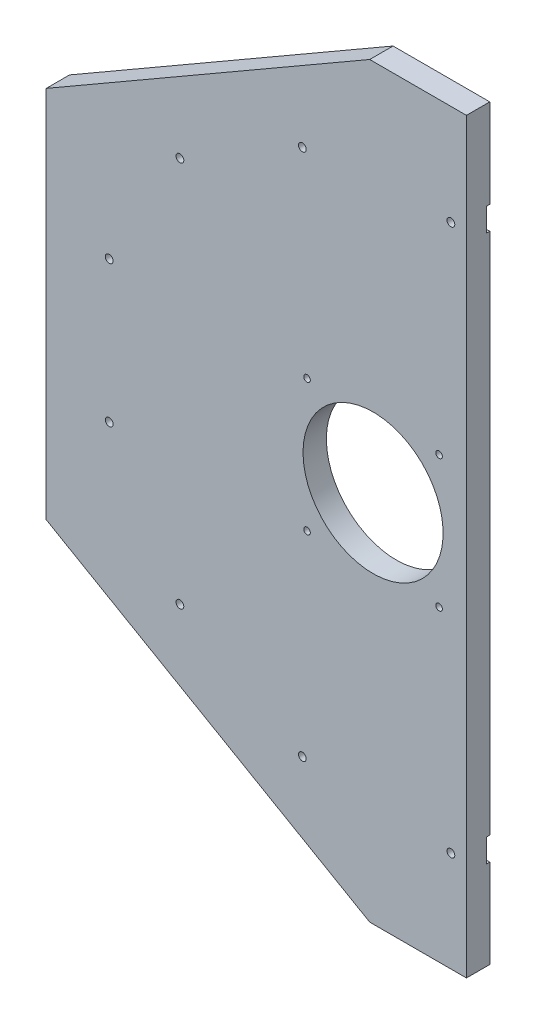
ISO-10303-21;
HEADER;
FILE_DESCRIPTION(('STEP AP214'),'2;1');
FILE_NAME('part.step','',(''),(''),'','','');
FILE_SCHEMA(('AUTOMOTIVE_DESIGN { 1 0 10303 214 1 1 1 1 }'));
ENDSEC;
DATA;
#1=APPLICATION_CONTEXT('core data for automotive mechanical design processes');
#2=APPLICATION_PROTOCOL_DEFINITION('international standard','automotive_design',2000,#1);
#3=PRODUCT_CONTEXT('',#1,'mechanical');
#4=PRODUCT('Part','Part','',(#3));
#5=PRODUCT_RELATED_PRODUCT_CATEGORY('part','',(#4));
#6=PRODUCT_DEFINITION_FORMATION('','',#4);
#7=PRODUCT_DEFINITION_CONTEXT('part definition',#1,'design');
#8=PRODUCT_DEFINITION('design','',#6,#7);
#9=PRODUCT_DEFINITION_SHAPE('','',#8);
#10=(LENGTH_UNIT() NAMED_UNIT(*) SI_UNIT(.MILLI.,.METRE.));
#11=(NAMED_UNIT(*) PLANE_ANGLE_UNIT() SI_UNIT($,.RADIAN.));
#12=(NAMED_UNIT(*) SI_UNIT($,.STERADIAN.) SOLID_ANGLE_UNIT());
#13=UNCERTAINTY_MEASURE_WITH_UNIT(LENGTH_MEASURE(1.E-05),#10,'distance_accuracy_value','');
#14=(GEOMETRIC_REPRESENTATION_CONTEXT(3) GLOBAL_UNCERTAINTY_ASSIGNED_CONTEXT((#13)) GLOBAL_UNIT_ASSIGNED_CONTEXT((#10,
#11,#12)) REPRESENTATION_CONTEXT('',''));
#15=CARTESIAN_POINT('',(0.,0.,0.));
#16=DIRECTION('',(0.,0.,1.));
#17=DIRECTION('',(1.,0.,0.));
#18=AXIS2_PLACEMENT_3D('',#15,#16,#17);
#19=CARTESIAN_POINT('',(0.,0.,0.));
#20=DIRECTION('',(0.,0.,1.));
#21=DIRECTION('',(1.,0.,0.));
#22=AXIS2_PLACEMENT_3D('',#19,#20,#21);
#23=PLANE('',#22);
#24=DIRECTION('',(-0.866025403784439,-0.5,0.));
#25=VECTOR('',#24,1.);
#26=CARTESIAN_POINT('',(-84.4615242270663,146.291651245989,0.));
#27=LINE('',#26,#25);
#28=CARTESIAN_POINT('',(77.8460969082652,240.,-2.22044604925031E-13));
#29=VERTEX_POINT('',#28);
#30=CARTESIAN_POINT('',(-130.,120.,-2.22044604925031E-13));
#31=VERTEX_POINT('',#30);
#32=EDGE_CURVE('E194',#29,#31,#27,.T.);
#33=ORIENTED_EDGE('',*,*,#32,.F.);
#34=DIRECTION('',(-1.,0.,0.));
#35=VECTOR('',#34,1.);
#36=CARTESIAN_POINT('',(0.,240.,0.));
#37=LINE('',#36,#35);
#38=CARTESIAN_POINT('',(140.,240.,0.));
#39=VERTEX_POINT('',#38);
#40=EDGE_CURVE('E174',#39,#29,#37,.T.);
#41=ORIENTED_EDGE('',*,*,#40,.F.);
#42=DIRECTION('',(0.,-1.,0.));
#43=VECTOR('',#42,1.);
#44=CARTESIAN_POINT('',(140.,0.,0.));
#45=LINE('',#44,#43);
#46=CARTESIAN_POINT('',(140.,183.,0.));
#47=VERTEX_POINT('',#46);
#48=EDGE_CURVE('E166',#39,#47,#45,.T.);
#49=ORIENTED_EDGE('',*,*,#48,.T.);
#50=DIRECTION('',(1.,0.,0.));
#51=VECTOR('',#50,1.);
#52=CARTESIAN_POINT('',(0.,183.,0.));
#53=LINE('',#52,#51);
#54=CARTESIAN_POINT('',(79.9999999999999,183.,0.));
#55=VERTEX_POINT('',#54);
#56=EDGE_CURVE('E205',#55,#47,#53,.T.);
#57=ORIENTED_EDGE('',*,*,#56,.F.);
#58=CARTESIAN_POINT('',(79.9999999999999,0.,0.));
#59=DIRECTION('',(0.,0.,1.));
#60=DIRECTION('',(1.,0.,0.));
#61=AXIS2_PLACEMENT_3D('',#58,#59,#60);
#62=CIRCLE('',#61,183.);
#63=CARTESIAN_POINT('',(79.9999999999999,-183.,0.));
#64=VERTEX_POINT('',#63);
#65=EDGE_CURVE('E229',#55,#64,#62,.T.);
#66=ORIENTED_EDGE('',*,*,#65,.T.);
#67=DIRECTION('',(1.,0.,0.));
#68=VECTOR('',#67,1.);
#69=CARTESIAN_POINT('',(0.,-183.,0.));
#70=LINE('',#69,#68);
#71=CARTESIAN_POINT('',(140.,-183.,0.));
#72=VERTEX_POINT('',#71);
#73=EDGE_CURVE('E232',#64,#72,#70,.T.);
#74=ORIENTED_EDGE('',*,*,#73,.T.);
#75=CARTESIAN_POINT('',(140.,-240.,0.));
#76=VERTEX_POINT('',#75);
#77=EDGE_CURVE('E160',#72,#76,#45,.T.);
#78=ORIENTED_EDGE('',*,*,#77,.T.);
#79=DIRECTION('',(-1.,0.,0.));
#80=VECTOR('',#79,1.);
#81=CARTESIAN_POINT('',(0.,-240.,0.));
#82=LINE('',#81,#80);
#83=CARTESIAN_POINT('',(77.8460969082652,-240.,-4.44089209850063E-13));
#84=VERTEX_POINT('',#83);
#85=EDGE_CURVE('E152',#76,#84,#82,.T.);
#86=ORIENTED_EDGE('',*,*,#85,.T.);
#87=DIRECTION('',(0.866025403784439,-0.5,0.));
#88=VECTOR('',#87,1.);
#89=CARTESIAN_POINT('',(-84.4615242270663,-146.291651245989,0.));
#90=LINE('',#89,#88);
#91=CARTESIAN_POINT('',(-130.,-120.,-2.22044604925031E-13));
#92=VERTEX_POINT('',#91);
#93=EDGE_CURVE('E139',#92,#84,#90,.T.);
#94=ORIENTED_EDGE('',*,*,#93,.F.);
#95=DIRECTION('',(0.,-1.,0.));
#96=VECTOR('',#95,1.);
#97=CARTESIAN_POINT('',(-130.,0.,0.));
#98=LINE('',#97,#96);
#99=EDGE_CURVE('E146',#31,#92,#98,.T.);
#100=ORIENTED_EDGE('',*,*,#99,.F.);
#101=EDGE_LOOP('',(#33,#41,#49,#57,#66,#74,#78,#86,#94,#100));
#102=FACE_BOUND('',#101,.T.);
#103=ADVANCED_FACE('F38',(#102),#23,.F.);
#104=CARTESIAN_POINT('',(0.,240.,15.));
#105=DIRECTION('',(0.,-1.,0.));
#106=DIRECTION('',(1.,0.,0.));
#107=AXIS2_PLACEMENT_3D('',#104,#105,#106);
#108=PLANE('',#107);
#109=DIRECTION('',(0.,0.,1.));
#110=VECTOR('',#109,1.);
#111=CARTESIAN_POINT('',(77.8460969082652,240.,-694.875213617524));
#112=LINE('',#111,#110);
#113=CARTESIAN_POINT('',(77.8460969082652,240.,14.9999999999998));
#114=VERTEX_POINT('',#113);
#115=EDGE_CURVE('E147',#29,#114,#112,.T.);
#116=ORIENTED_EDGE('',*,*,#115,.T.);
#117=DIRECTION('',(-1.,0.,0.));
#118=VECTOR('',#117,1.);
#119=CARTESIAN_POINT('',(0.,240.,15.));
#120=LINE('',#119,#118);
#121=CARTESIAN_POINT('',(140.,240.,15.));
#122=VERTEX_POINT('',#121);
#123=EDGE_CURVE('E170',#122,#114,#120,.T.);
#124=ORIENTED_EDGE('',*,*,#123,.F.);
#125=DIRECTION('',(0.,0.,-1.));
#126=VECTOR('',#125,1.);
#127=CARTESIAN_POINT('',(140.,240.,15.));
#128=LINE('',#127,#126);
#129=EDGE_CURVE('E177',#122,#39,#128,.T.);
#130=ORIENTED_EDGE('',*,*,#129,.T.);
#131=ORIENTED_EDGE('',*,*,#40,.T.);
#132=EDGE_LOOP('',(#116,#124,#130,#131));
#133=FACE_BOUND('',#132,.T.);
#134=ADVANCED_FACE('F260',(#133),#108,.F.);
#135=CARTESIAN_POINT('',(0.,0.,15.));
#136=DIRECTION('',(0.,0.,1.));
#137=DIRECTION('',(1.,0.,0.));
#138=AXIS2_PLACEMENT_3D('',#135,#136,#137);
#139=PLANE('',#138);
#140=CARTESIAN_POINT('',(130.,175.5,15.));
#141=DIRECTION('',(0.,0.,-1.));
#142=DIRECTION('',(-1.,0.,0.));
#143=AXIS2_PLACEMENT_3D('',#140,#141,#142);
#144=CIRCLE('',#143,2.49999999999997);
#145=CARTESIAN_POINT('',(127.5,175.5,15.));
#146=VERTEX_POINT('',#145);
#147=EDGE_CURVE('E406',#146,#146,#144,.T.);
#148=ORIENTED_EDGE('',*,*,#147,.T.);
#149=EDGE_LOOP('',(#148));
#150=FACE_BOUND('',#149,.T.);
#151=CARTESIAN_POINT('',(34.5772575845051,169.519982513731,15.));
#152=DIRECTION('',(0.,0.,-1.));
#153=DIRECTION('',(-1.,0.,0.));
#154=AXIS2_PLACEMENT_3D('',#151,#152,#153);
#155=CIRCLE('',#154,2.49999999999999);
#156=CARTESIAN_POINT('',(32.0772575845051,169.519982513731,15.));
#157=VERTEX_POINT('',#156);
#158=EDGE_CURVE('E416',#157,#157,#155,.T.);
#159=ORIENTED_EDGE('',*,*,#158,.T.);
#160=EDGE_LOOP('',(#159));
#161=FACE_BOUND('',#160,.T.);
#162=CARTESIAN_POINT('',(-44.0972400982411,124.097240098237,15.));
#163=DIRECTION('',(0.,0.,-1.));
#164=DIRECTION('',(-1.,0.,0.));
#165=AXIS2_PLACEMENT_3D('',#162,#163,#164);
#166=CIRCLE('',#165,2.49999999999999);
#167=CARTESIAN_POINT('',(-46.5972400982411,124.097240098237,15.));
#168=VERTEX_POINT('',#167);
#169=EDGE_CURVE('E422',#168,#168,#166,.T.);
#170=ORIENTED_EDGE('',*,*,#169,.T.);
#171=EDGE_LOOP('',(#170));
#172=FACE_BOUND('',#171,.T.);
#173=CARTESIAN_POINT('',(-89.5199825137323,45.4227424154895,15.));
#174=DIRECTION('',(0.,0.,-1.));
#175=DIRECTION('',(-1.,0.,0.));
#176=AXIS2_PLACEMENT_3D('',#173,#174,#175);
#177=CIRCLE('',#176,2.49999999999999);
#178=CARTESIAN_POINT('',(-92.0199825137323,45.4227424154895,15.));
#179=VERTEX_POINT('',#178);
#180=EDGE_CURVE('E428',#179,#179,#177,.T.);
#181=ORIENTED_EDGE('',*,*,#180,.T.);
#182=EDGE_LOOP('',(#181));
#183=FACE_BOUND('',#182,.T.);
#184=CARTESIAN_POINT('',(-89.5199825137308,-45.4227424154954,15.));
#185=DIRECTION('',(0.,0.,-1.));
#186=DIRECTION('',(-1.,0.,0.));
#187=AXIS2_PLACEMENT_3D('',#184,#185,#186);
#188=CIRCLE('',#187,2.49999999999999);
#189=CARTESIAN_POINT('',(-92.0199825137308,-45.4227424154954,15.));
#190=VERTEX_POINT('',#189);
#191=EDGE_CURVE('E434',#190,#190,#188,.T.);
#192=ORIENTED_EDGE('',*,*,#191,.T.);
#193=EDGE_LOOP('',(#192));
#194=FACE_BOUND('',#193,.T.);
#195=CARTESIAN_POINT('',(-44.0972400982368,-124.097240098241,15.));
#196=DIRECTION('',(0.,0.,-1.));
#197=DIRECTION('',(-1.,0.,0.));
#198=AXIS2_PLACEMENT_3D('',#195,#196,#197);
#199=CIRCLE('',#198,2.49999999999999);
#200=CARTESIAN_POINT('',(-46.5972400982368,-124.097240098241,15.));
#201=VERTEX_POINT('',#200);
#202=EDGE_CURVE('E440',#201,#201,#199,.T.);
#203=ORIENTED_EDGE('',*,*,#202,.T.);
#204=EDGE_LOOP('',(#203));
#205=FACE_BOUND('',#204,.T.);
#206=CARTESIAN_POINT('',(34.5772575845086,-169.519982513732,15.));
#207=DIRECTION('',(0.,0.,-1.));
#208=DIRECTION('',(-1.,0.,0.));
#209=AXIS2_PLACEMENT_3D('',#206,#207,#208);
#210=CIRCLE('',#209,2.49999999999999);
#211=CARTESIAN_POINT('',(32.0772575845086,-169.519982513732,15.));
#212=VERTEX_POINT('',#211);
#213=EDGE_CURVE('E446',#212,#212,#210,.T.);
#214=ORIENTED_EDGE('',*,*,#213,.T.);
#215=EDGE_LOOP('',(#214));
#216=FACE_BOUND('',#215,.T.);
#217=CARTESIAN_POINT('',(130.,-175.5,15.));
#218=DIRECTION('',(0.,0.,-1.));
#219=DIRECTION('',(-1.,0.,0.));
#220=AXIS2_PLACEMENT_3D('',#217,#218,#219);
#221=CIRCLE('',#220,2.49999999999997);
#222=CARTESIAN_POINT('',(127.5,-175.5,15.));
#223=VERTEX_POINT('',#222);
#224=EDGE_CURVE('E452',#223,#223,#221,.T.);
#225=ORIENTED_EDGE('',*,*,#224,.T.);
#226=EDGE_LOOP('',(#225));
#227=FACE_BOUND('',#226,.T.);
#228=CARTESIAN_POINT('',(122.426406871193,42.4264068711931,15.));
#229=DIRECTION('',(0.,0.,-1.));
#230=DIRECTION('',(-1.,0.,0.));
#231=AXIS2_PLACEMENT_3D('',#228,#229,#230);
#232=CIRCLE('',#231,2.09999999999999);
#233=CARTESIAN_POINT('',(120.326406871193,42.4264068711931,15.));
#234=VERTEX_POINT('',#233);
#235=EDGE_CURVE('E456',#234,#234,#232,.T.);
#236=ORIENTED_EDGE('',*,*,#235,.T.);
#237=EDGE_LOOP('',(#236));
#238=FACE_BOUND('',#237,.T.);
#239=CARTESIAN_POINT('',(37.5735931288069,42.4264068711939,15.));
#240=DIRECTION('',(0.,0.,-1.));
#241=DIRECTION('',(-1.,0.,0.));
#242=AXIS2_PLACEMENT_3D('',#239,#240,#241);
#243=CIRCLE('',#242,2.1);
#244=CARTESIAN_POINT('',(35.4735931288069,42.4264068711939,15.));
#245=VERTEX_POINT('',#244);
#246=EDGE_CURVE('E460',#245,#245,#243,.T.);
#247=ORIENTED_EDGE('',*,*,#246,.T.);
#248=EDGE_LOOP('',(#247));
#249=FACE_BOUND('',#248,.T.);
#250=CARTESIAN_POINT('',(37.573593128806,-42.4264068711918,15.));
#251=DIRECTION('',(0.,0.,-1.));
#252=DIRECTION('',(-1.,0.,0.));
#253=AXIS2_PLACEMENT_3D('',#250,#251,#252);
#254=CIRCLE('',#253,2.1);
#255=CARTESIAN_POINT('',(35.473593128806,-42.4264068711918,15.));
#256=VERTEX_POINT('',#255);
#257=EDGE_CURVE('E464',#256,#256,#254,.T.);
#258=ORIENTED_EDGE('',*,*,#257,.T.);
#259=EDGE_LOOP('',(#258));
#260=FACE_BOUND('',#259,.T.);
#261=CARTESIAN_POINT('',(122.426406871192,-42.4264068711926,15.));
#262=DIRECTION('',(0.,0.,-1.));
#263=DIRECTION('',(-1.,0.,0.));
#264=AXIS2_PLACEMENT_3D('',#261,#262,#263);
#265=CIRCLE('',#264,2.09999999999999);
#266=CARTESIAN_POINT('',(120.326406871192,-42.4264068711926,15.));
#267=VERTEX_POINT('',#266);
#268=EDGE_CURVE('E155',#267,#267,#265,.T.);
#269=ORIENTED_EDGE('',*,*,#268,.T.);
#270=EDGE_LOOP('',(#269));
#271=FACE_BOUND('',#270,.T.);
#272=CARTESIAN_POINT('',(79.9999999999999,0.,15.));
#273=DIRECTION('',(0.,0.,-1.));
#274=DIRECTION('',(-1.,0.,0.));
#275=AXIS2_PLACEMENT_3D('',#272,#273,#274);
#276=CIRCLE('',#275,45.);
#277=CARTESIAN_POINT('',(34.9999999999999,0.,15.));
#278=VERTEX_POINT('',#277);
#279=EDGE_CURVE('E202',#278,#278,#276,.T.);
#280=ORIENTED_EDGE('',*,*,#279,.T.);
#281=EDGE_LOOP('',(#280));
#282=FACE_BOUND('',#281,.T.);
#283=ORIENTED_EDGE('',*,*,#123,.T.);
#284=DIRECTION('',(-0.866025403784439,-0.5,0.));
#285=VECTOR('',#284,1.);
#286=CARTESIAN_POINT('',(-84.4615242270663,146.291651245989,15.));
#287=LINE('',#286,#285);
#288=CARTESIAN_POINT('',(-130.,120.,14.9999999999998));
#289=VERTEX_POINT('',#288);
#290=EDGE_CURVE('E11',#114,#289,#287,.T.);
#291=ORIENTED_EDGE('',*,*,#290,.T.);
#292=DIRECTION('',(0.,-1.,0.));
#293=VECTOR('',#292,1.);
#294=CARTESIAN_POINT('',(-130.,0.,15.));
#295=LINE('',#294,#293);
#296=CARTESIAN_POINT('',(-130.,-120.,14.9999999999998));
#297=VERTEX_POINT('',#296);
#298=EDGE_CURVE('E46',#289,#297,#295,.T.);
#299=ORIENTED_EDGE('',*,*,#298,.T.);
#300=DIRECTION('',(0.866025403784439,-0.5,0.));
#301=VECTOR('',#300,1.);
#302=CARTESIAN_POINT('',(-84.4615242270663,-146.291651245989,15.));
#303=LINE('',#302,#301);
#304=CARTESIAN_POINT('',(77.8460969082652,-240.,15.));
#305=VERTEX_POINT('',#304);
#306=EDGE_CURVE('E181',#297,#305,#303,.T.);
#307=ORIENTED_EDGE('',*,*,#306,.T.);
#308=DIRECTION('',(-1.,0.,0.));
#309=VECTOR('',#308,1.);
#310=CARTESIAN_POINT('',(0.,-240.,15.));
#311=LINE('',#310,#309);
#312=CARTESIAN_POINT('',(140.,-240.,15.));
#313=VERTEX_POINT('',#312);
#314=EDGE_CURVE('E154',#313,#305,#311,.T.);
#315=ORIENTED_EDGE('',*,*,#314,.F.);
#316=DIRECTION('',(0.,-1.,0.));
#317=VECTOR('',#316,1.);
#318=CARTESIAN_POINT('',(140.,0.,15.));
#319=LINE('',#318,#317);
#320=EDGE_CURVE('E254',#122,#313,#319,.T.);
#321=ORIENTED_EDGE('',*,*,#320,.F.);
#322=EDGE_LOOP('',(#283,#291,#299,#307,#315,#321));
#323=FACE_BOUND('',#322,.T.);
#324=ADVANCED_FACE('F185',(#150,#161,#172,#183,#194,#205,#216,#227,#238,#249,#260,#271,#282,
#323),#139,.T.);
#325=CARTESIAN_POINT('',(140.,0.,15.));
#326=DIRECTION('',(1.,0.,0.));
#327=DIRECTION('',(0.,1.,0.));
#328=AXIS2_PLACEMENT_3D('',#325,#326,#327);
#329=PLANE('',#328);
#330=DIRECTION('',(0.,0.,-1.));
#331=VECTOR('',#330,1.);
#332=CARTESIAN_POINT('',(140.,183.,2.));
#333=LINE('',#332,#331);
#334=CARTESIAN_POINT('',(140.,183.,2.));
#335=VERTEX_POINT('',#334);
#336=EDGE_CURVE('E240',#335,#47,#333,.T.);
#337=ORIENTED_EDGE('',*,*,#336,.T.);
#338=ORIENTED_EDGE('',*,*,#48,.F.);
#339=ORIENTED_EDGE('',*,*,#129,.F.);
#340=ORIENTED_EDGE('',*,*,#320,.T.);
#341=DIRECTION('',(0.,0.,-1.));
#342=VECTOR('',#341,1.);
#343=CARTESIAN_POINT('',(140.,-240.,15.));
#344=LINE('',#343,#342);
#345=EDGE_CURVE('E179',#313,#76,#344,.T.);
#346=ORIENTED_EDGE('',*,*,#345,.T.);
#347=ORIENTED_EDGE('',*,*,#77,.F.);
#348=DIRECTION('',(0.,0.,-1.));
#349=VECTOR('',#348,1.);
#350=CARTESIAN_POINT('',(140.,-183.,2.));
#351=LINE('',#350,#349);
#352=CARTESIAN_POINT('',(140.,-183.,2.));
#353=VERTEX_POINT('',#352);
#354=EDGE_CURVE('E251',#353,#72,#351,.T.);
#355=ORIENTED_EDGE('',*,*,#354,.F.);
#356=DIRECTION('',(0.,-1.,0.));
#357=VECTOR('',#356,1.);
#358=CARTESIAN_POINT('',(140.,0.,2.));
#359=LINE('',#358,#357);
#360=CARTESIAN_POINT('',(140.,-168.,2.));
#361=VERTEX_POINT('',#360);
#362=EDGE_CURVE('E216',#361,#353,#359,.T.);
#363=ORIENTED_EDGE('',*,*,#362,.F.);
#364=DIRECTION('',(0.,0.,-1.));
#365=VECTOR('',#364,1.);
#366=CARTESIAN_POINT('',(140.,-168.,2.));
#367=LINE('',#366,#365);
#368=CARTESIAN_POINT('',(140.,-168.,0.));
#369=VERTEX_POINT('',#368);
#370=EDGE_CURVE('E248',#361,#369,#367,.T.);
#371=ORIENTED_EDGE('',*,*,#370,.T.);
#372=CARTESIAN_POINT('',(140.,168.,0.));
#373=VERTEX_POINT('',#372);
#374=EDGE_CURVE('E164',#373,#369,#45,.T.);
#375=ORIENTED_EDGE('',*,*,#374,.F.);
#376=DIRECTION('',(0.,0.,-1.));
#377=VECTOR('',#376,1.);
#378=CARTESIAN_POINT('',(140.,168.,2.));
#379=LINE('',#378,#377);
#380=CARTESIAN_POINT('',(140.,168.,2.));
#381=VERTEX_POINT('',#380);
#382=EDGE_CURVE('E61',#381,#373,#379,.T.);
#383=ORIENTED_EDGE('',*,*,#382,.F.);
#384=EDGE_CURVE('E220',#335,#381,#359,.T.);
#385=ORIENTED_EDGE('',*,*,#384,.F.);
#386=EDGE_LOOP('',(#337,#338,#339,#340,#346,#347,#355,#363,#371,#375,#383,#385));
#387=FACE_BOUND('',#386,.T.);
#388=ADVANCED_FACE('F264',(#387),#329,.T.);
#389=CARTESIAN_POINT('',(0.,-240.,15.));
#390=DIRECTION('',(0.,-1.,0.));
#391=DIRECTION('',(1.,0.,0.));
#392=AXIS2_PLACEMENT_3D('',#389,#390,#391);
#393=PLANE('',#392);
#394=DIRECTION('',(0.,0.,1.));
#395=VECTOR('',#394,1.);
#396=CARTESIAN_POINT('',(77.8460969082652,-240.,-694.875213617524));
#397=LINE('',#396,#395);
#398=EDGE_CURVE('E53',#84,#305,#397,.T.);
#399=ORIENTED_EDGE('',*,*,#398,.F.);
#400=ORIENTED_EDGE('',*,*,#85,.F.);
#401=ORIENTED_EDGE('',*,*,#345,.F.);
#402=ORIENTED_EDGE('',*,*,#314,.T.);
#403=EDGE_LOOP('',(#399,#400,#401,#402));
#404=FACE_BOUND('',#403,.T.);
#405=ADVANCED_FACE('F40',(#404),#393,.T.);
#406=CARTESIAN_POINT('',(122.426406871193,42.4264068711931,0.));
#407=DIRECTION('',(0.,0.,-1.));
#408=DIRECTION('',(-1.,0.,0.));
#409=AXIS2_PLACEMENT_3D('',#406,#407,#408);
#410=CIRCLE('',#409,2.1);
#411=CARTESIAN_POINT('',(120.326406871193,42.4264068711931,0.));
#412=VERTEX_POINT('',#411);
#413=EDGE_CURVE('E322',#412,#412,#410,.T.);
#414=ORIENTED_EDGE('',*,*,#413,.F.);
#415=EDGE_LOOP('',(#414));
#416=FACE_BOUND('',#415,.T.);
#417=CARTESIAN_POINT('',(37.5735931288069,42.4264068711939,0.));
#418=DIRECTION('',(0.,0.,-1.));
#419=DIRECTION('',(-1.,0.,0.));
#420=AXIS2_PLACEMENT_3D('',#417,#418,#419);
#421=CIRCLE('',#420,2.1);
#422=CARTESIAN_POINT('',(35.4735931288069,42.4264068711939,0.));
#423=VERTEX_POINT('',#422);
#424=EDGE_CURVE('E326',#423,#423,#421,.T.);
#425=ORIENTED_EDGE('',*,*,#424,.F.);
#426=EDGE_LOOP('',(#425));
#427=FACE_BOUND('',#426,.T.);
#428=CARTESIAN_POINT('',(37.573593128806,-42.4264068711918,0.));
#429=DIRECTION('',(0.,0.,-1.));
#430=DIRECTION('',(-1.,0.,0.));
#431=AXIS2_PLACEMENT_3D('',#428,#429,#430);
#432=CIRCLE('',#431,2.1);
#433=CARTESIAN_POINT('',(35.473593128806,-42.4264068711918,0.));
#434=VERTEX_POINT('',#433);
#435=EDGE_CURVE('E330',#434,#434,#432,.T.);
#436=ORIENTED_EDGE('',*,*,#435,.F.);
#437=EDGE_LOOP('',(#436));
#438=FACE_BOUND('',#437,.T.);
#439=CARTESIAN_POINT('',(122.426406871192,-42.4264068711926,0.));
#440=DIRECTION('',(0.,0.,-1.));
#441=DIRECTION('',(-1.,0.,0.));
#442=AXIS2_PLACEMENT_3D('',#439,#440,#441);
#443=CIRCLE('',#442,2.1);
#444=CARTESIAN_POINT('',(120.326406871192,-42.4264068711926,0.));
#445=VERTEX_POINT('',#444);
#446=EDGE_CURVE('E334',#445,#445,#443,.T.);
#447=ORIENTED_EDGE('',*,*,#446,.F.);
#448=EDGE_LOOP('',(#447));
#449=FACE_BOUND('',#448,.T.);
#450=CARTESIAN_POINT('',(79.9999999999999,0.,0.));
#451=DIRECTION('',(0.,0.,-1.));
#452=DIRECTION('',(-1.,0.,0.));
#453=AXIS2_PLACEMENT_3D('',#450,#451,#452);
#454=CIRCLE('',#453,45.);
#455=CARTESIAN_POINT('',(34.9999999999999,0.,0.));
#456=VERTEX_POINT('',#455);
#457=EDGE_CURVE('E201',#456,#456,#454,.T.);
#458=ORIENTED_EDGE('',*,*,#457,.F.);
#459=EDGE_LOOP('',(#458));
#460=FACE_BOUND('',#459,.T.);
#461=ORIENTED_EDGE('',*,*,#374,.T.);
#462=DIRECTION('',(1.,0.,0.));
#463=VECTOR('',#462,1.);
#464=CARTESIAN_POINT('',(0.,-168.,0.));
#465=LINE('',#464,#463);
#466=CARTESIAN_POINT('',(79.9999999999999,-168.,0.));
#467=VERTEX_POINT('',#466);
#468=EDGE_CURVE('E234',#467,#369,#465,.T.);
#469=ORIENTED_EDGE('',*,*,#468,.F.);
#470=CARTESIAN_POINT('',(79.9999999999999,0.,0.));
#471=DIRECTION('',(0.,0.,1.));
#472=DIRECTION('',(1.,0.,0.));
#473=AXIS2_PLACEMENT_3D('',#470,#471,#472);
#474=CIRCLE('',#473,168.);
#475=CARTESIAN_POINT('',(79.9999999999999,168.,0.));
#476=VERTEX_POINT('',#475);
#477=EDGE_CURVE('E236',#476,#467,#474,.T.);
#478=ORIENTED_EDGE('',*,*,#477,.F.);
#479=DIRECTION('',(1.,0.,0.));
#480=VECTOR('',#479,1.);
#481=CARTESIAN_POINT('',(0.,168.,0.));
#482=LINE('',#481,#480);
#483=EDGE_CURVE('E212',#476,#373,#482,.T.);
#484=ORIENTED_EDGE('',*,*,#483,.T.);
#485=EDGE_LOOP('',(#461,#469,#478,#484));
#486=FACE_BOUND('',#485,.T.);
#487=ADVANCED_FACE('F293',(#416,#427,#438,#449,#460,#486),#23,.F.);
#488=CARTESIAN_POINT('',(0.,183.,2.));
#489=DIRECTION('',(0.,1.,0.));
#490=DIRECTION('',(0.,0.,1.));
#491=AXIS2_PLACEMENT_3D('',#488,#489,#490);
#492=PLANE('',#491);
#493=ORIENTED_EDGE('',*,*,#56,.T.);
#494=ORIENTED_EDGE('',*,*,#336,.F.);
#495=DIRECTION('',(1.,0.,0.));
#496=VECTOR('',#495,1.);
#497=CARTESIAN_POINT('',(0.,183.,2.));
#498=LINE('',#497,#496);
#499=CARTESIAN_POINT('',(79.9999999999999,183.,2.));
#500=VERTEX_POINT('',#499);
#501=EDGE_CURVE('E208',#500,#335,#498,.T.);
#502=ORIENTED_EDGE('',*,*,#501,.F.);
#503=DIRECTION('',(0.,0.,-1.));
#504=VECTOR('',#503,1.);
#505=CARTESIAN_POINT('',(79.9999999999999,183.,2.));
#506=LINE('',#505,#504);
#507=EDGE_CURVE('E162',#500,#55,#506,.T.);
#508=ORIENTED_EDGE('',*,*,#507,.T.);
#509=EDGE_LOOP('',(#493,#494,#502,#508));
#510=FACE_BOUND('',#509,.T.);
#511=ADVANCED_FACE('F269',(#510),#492,.F.);
#512=CARTESIAN_POINT('',(79.9999999999999,0.,2.));
#513=DIRECTION('',(0.,0.,-1.));
#514=DIRECTION('',(-1.,0.,0.));
#515=AXIS2_PLACEMENT_3D('',#512,#513,#514);
#516=CYLINDRICAL_SURFACE('',#515,183.);
#517=ORIENTED_EDGE('',*,*,#65,.F.);
#518=ORIENTED_EDGE('',*,*,#507,.F.);
#519=CARTESIAN_POINT('',(79.9999999999999,0.,2.));
#520=DIRECTION('',(0.,0.,1.));
#521=DIRECTION('',(1.,0.,0.));
#522=AXIS2_PLACEMENT_3D('',#519,#520,#521);
#523=CIRCLE('',#522,183.);
#524=CARTESIAN_POINT('',(79.9999999999999,-183.,2.));
#525=VERTEX_POINT('',#524);
#526=EDGE_CURVE('E211',#500,#525,#523,.T.);
#527=ORIENTED_EDGE('',*,*,#526,.T.);
#528=DIRECTION('',(0.,0.,-1.));
#529=VECTOR('',#528,1.);
#530=CARTESIAN_POINT('',(79.9999999999999,-183.,2.));
#531=LINE('',#530,#529);
#532=EDGE_CURVE('E167',#525,#64,#531,.T.);
#533=ORIENTED_EDGE('',*,*,#532,.T.);
#534=EDGE_LOOP('',(#517,#518,#527,#533));
#535=FACE_BOUND('',#534,.T.);
#536=ADVANCED_FACE('F278',(#535),#516,.F.);
#537=CARTESIAN_POINT('',(0.,-183.,2.));
#538=DIRECTION('',(0.,1.,0.));
#539=DIRECTION('',(0.,0.,1.));
#540=AXIS2_PLACEMENT_3D('',#537,#538,#539);
#541=PLANE('',#540);
#542=ORIENTED_EDGE('',*,*,#73,.F.);
#543=ORIENTED_EDGE('',*,*,#532,.F.);
#544=DIRECTION('',(1.,0.,0.));
#545=VECTOR('',#544,1.);
#546=CARTESIAN_POINT('',(0.,-183.,2.));
#547=LINE('',#546,#545);
#548=EDGE_CURVE('E214',#525,#353,#547,.T.);
#549=ORIENTED_EDGE('',*,*,#548,.T.);
#550=ORIENTED_EDGE('',*,*,#354,.T.);
#551=EDGE_LOOP('',(#542,#543,#549,#550));
#552=FACE_BOUND('',#551,.T.);
#553=ADVANCED_FACE('F281',(#552),#541,.T.);
#554=CARTESIAN_POINT('',(0.,-168.,2.));
#555=DIRECTION('',(0.,1.,0.));
#556=DIRECTION('',(0.,0.,1.));
#557=AXIS2_PLACEMENT_3D('',#554,#555,#556);
#558=PLANE('',#557);
#559=ORIENTED_EDGE('',*,*,#468,.T.);
#560=ORIENTED_EDGE('',*,*,#370,.F.);
#561=DIRECTION('',(1.,0.,0.));
#562=VECTOR('',#561,1.);
#563=CARTESIAN_POINT('',(0.,-168.,2.));
#564=LINE('',#563,#562);
#565=CARTESIAN_POINT('',(79.9999999999999,-168.,2.));
#566=VERTEX_POINT('',#565);
#567=EDGE_CURVE('E219',#566,#361,#564,.T.);
#568=ORIENTED_EDGE('',*,*,#567,.F.);
#569=DIRECTION('',(0.,0.,-1.));
#570=VECTOR('',#569,1.);
#571=CARTESIAN_POINT('',(79.9999999999999,-168.,2.));
#572=LINE('',#571,#570);
#573=EDGE_CURVE('E246',#566,#467,#572,.T.);
#574=ORIENTED_EDGE('',*,*,#573,.T.);
#575=EDGE_LOOP('',(#559,#560,#568,#574));
#576=FACE_BOUND('',#575,.T.);
#577=ADVANCED_FACE('F289',(#576),#558,.F.);
#578=CARTESIAN_POINT('',(79.9999999999999,0.,2.));
#579=DIRECTION('',(0.,0.,-1.));
#580=DIRECTION('',(-1.,0.,0.));
#581=AXIS2_PLACEMENT_3D('',#578,#579,#580);
#582=CYLINDRICAL_SURFACE('',#581,168.);
#583=ORIENTED_EDGE('',*,*,#477,.T.);
#584=ORIENTED_EDGE('',*,*,#573,.F.);
#585=CARTESIAN_POINT('',(79.9999999999999,0.,2.));
#586=DIRECTION('',(0.,0.,1.));
#587=DIRECTION('',(1.,0.,0.));
#588=AXIS2_PLACEMENT_3D('',#585,#586,#587);
#589=CIRCLE('',#588,168.);
#590=CARTESIAN_POINT('',(79.9999999999999,168.,2.));
#591=VERTEX_POINT('',#590);
#592=EDGE_CURVE('E223',#591,#566,#589,.T.);
#593=ORIENTED_EDGE('',*,*,#592,.F.);
#594=DIRECTION('',(0.,0.,-1.));
#595=VECTOR('',#594,1.);
#596=CARTESIAN_POINT('',(79.9999999999999,168.,2.));
#597=LINE('',#596,#595);
#598=EDGE_CURVE('E244',#591,#476,#597,.T.);
#599=ORIENTED_EDGE('',*,*,#598,.T.);
#600=EDGE_LOOP('',(#583,#584,#593,#599));
#601=FACE_BOUND('',#600,.T.);
#602=ADVANCED_FACE('F296',(#601),#582,.T.);
#603=CARTESIAN_POINT('',(0.,168.,2.));
#604=DIRECTION('',(0.,1.,0.));
#605=DIRECTION('',(0.,0.,1.));
#606=AXIS2_PLACEMENT_3D('',#603,#604,#605);
#607=PLANE('',#606);
#608=ORIENTED_EDGE('',*,*,#483,.F.);
#609=ORIENTED_EDGE('',*,*,#598,.F.);
#610=DIRECTION('',(1.,0.,0.));
#611=VECTOR('',#610,1.);
#612=CARTESIAN_POINT('',(0.,168.,2.));
#613=LINE('',#612,#611);
#614=EDGE_CURVE('E226',#591,#381,#613,.T.);
#615=ORIENTED_EDGE('',*,*,#614,.T.);
#616=ORIENTED_EDGE('',*,*,#382,.T.);
#617=EDGE_LOOP('',(#608,#609,#615,#616));
#618=FACE_BOUND('',#617,.T.);
#619=ADVANCED_FACE('F294',(#618),#607,.T.);
#620=CARTESIAN_POINT('',(0.,0.,2.));
#621=DIRECTION('',(0.,0.,1.));
#622=DIRECTION('',(1.,0.,0.));
#623=AXIS2_PLACEMENT_3D('',#620,#621,#622);
#624=PLANE('',#623);
#625=CARTESIAN_POINT('',(130.,175.5,2.));
#626=DIRECTION('',(0.,0.,-1.));
#627=DIRECTION('',(-1.,0.,0.));
#628=AXIS2_PLACEMENT_3D('',#625,#626,#627);
#629=CIRCLE('',#628,2.5);
#630=CARTESIAN_POINT('',(127.5,175.5,2.));
#631=VERTEX_POINT('',#630);
#632=EDGE_CURVE('E409',#631,#631,#629,.T.);
#633=ORIENTED_EDGE('',*,*,#632,.F.);
#634=EDGE_LOOP('',(#633));
#635=FACE_BOUND('',#634,.T.);
#636=CARTESIAN_POINT('',(34.5772575845051,169.519982513731,2.));
#637=DIRECTION('',(0.,0.,-1.));
#638=DIRECTION('',(-1.,0.,0.));
#639=AXIS2_PLACEMENT_3D('',#636,#637,#638);
#640=CIRCLE('',#639,2.49999999999999);
#641=CARTESIAN_POINT('',(32.0772575845051,169.519982513731,2.));
#642=VERTEX_POINT('',#641);
#643=EDGE_CURVE('E411',#642,#642,#640,.T.);
#644=ORIENTED_EDGE('',*,*,#643,.F.);
#645=EDGE_LOOP('',(#644));
#646=FACE_BOUND('',#645,.T.);
#647=CARTESIAN_POINT('',(-44.0972400982411,124.097240098237,2.));
#648=DIRECTION('',(0.,0.,-1.));
#649=DIRECTION('',(-1.,0.,0.));
#650=AXIS2_PLACEMENT_3D('',#647,#648,#649);
#651=CIRCLE('',#650,2.49999999999999);
#652=CARTESIAN_POINT('',(-46.5972400982411,124.097240098237,2.));
#653=VERTEX_POINT('',#652);
#654=EDGE_CURVE('E419',#653,#653,#651,.T.);
#655=ORIENTED_EDGE('',*,*,#654,.F.);
#656=EDGE_LOOP('',(#655));
#657=FACE_BOUND('',#656,.T.);
#658=CARTESIAN_POINT('',(-89.5199825137323,45.4227424154895,2.));
#659=DIRECTION('',(0.,0.,-1.));
#660=DIRECTION('',(-1.,0.,0.));
#661=AXIS2_PLACEMENT_3D('',#658,#659,#660);
#662=CIRCLE('',#661,2.49999999999999);
#663=CARTESIAN_POINT('',(-92.0199825137323,45.4227424154895,2.));
#664=VERTEX_POINT('',#663);
#665=EDGE_CURVE('E425',#664,#664,#662,.T.);
#666=ORIENTED_EDGE('',*,*,#665,.F.);
#667=EDGE_LOOP('',(#666));
#668=FACE_BOUND('',#667,.T.);
#669=CARTESIAN_POINT('',(-89.5199825137308,-45.4227424154954,2.));
#670=DIRECTION('',(0.,0.,-1.));
#671=DIRECTION('',(-1.,0.,0.));
#672=AXIS2_PLACEMENT_3D('',#669,#670,#671);
#673=CIRCLE('',#672,2.49999999999999);
#674=CARTESIAN_POINT('',(-92.0199825137308,-45.4227424154954,2.));
#675=VERTEX_POINT('',#674);
#676=EDGE_CURVE('E431',#675,#675,#673,.T.);
#677=ORIENTED_EDGE('',*,*,#676,.F.);
#678=EDGE_LOOP('',(#677));
#679=FACE_BOUND('',#678,.T.);
#680=CARTESIAN_POINT('',(-44.0972400982368,-124.097240098241,2.));
#681=DIRECTION('',(0.,0.,-1.));
#682=DIRECTION('',(-1.,0.,0.));
#683=AXIS2_PLACEMENT_3D('',#680,#681,#682);
#684=CIRCLE('',#683,2.49999999999999);
#685=CARTESIAN_POINT('',(-46.5972400982368,-124.097240098241,2.));
#686=VERTEX_POINT('',#685);
#687=EDGE_CURVE('E437',#686,#686,#684,.T.);
#688=ORIENTED_EDGE('',*,*,#687,.F.);
#689=EDGE_LOOP('',(#688));
#690=FACE_BOUND('',#689,.T.);
#691=CARTESIAN_POINT('',(34.5772575845086,-169.519982513732,2.));
#692=DIRECTION('',(0.,0.,-1.));
#693=DIRECTION('',(-1.,0.,0.));
#694=AXIS2_PLACEMENT_3D('',#691,#692,#693);
#695=CIRCLE('',#694,2.49999999999999);
#696=CARTESIAN_POINT('',(32.0772575845086,-169.519982513732,2.));
#697=VERTEX_POINT('',#696);
#698=EDGE_CURVE('E443',#697,#697,#695,.T.);
#699=ORIENTED_EDGE('',*,*,#698,.F.);
#700=EDGE_LOOP('',(#699));
#701=FACE_BOUND('',#700,.T.);
#702=CARTESIAN_POINT('',(130.,-175.5,2.));
#703=DIRECTION('',(0.,0.,-1.));
#704=DIRECTION('',(-1.,0.,0.));
#705=AXIS2_PLACEMENT_3D('',#702,#703,#704);
#706=CIRCLE('',#705,2.5);
#707=CARTESIAN_POINT('',(127.5,-175.5,2.));
#708=VERTEX_POINT('',#707);
#709=EDGE_CURVE('E449',#708,#708,#706,.T.);
#710=ORIENTED_EDGE('',*,*,#709,.F.);
#711=EDGE_LOOP('',(#710));
#712=FACE_BOUND('',#711,.T.);
#713=ORIENTED_EDGE('',*,*,#501,.T.);
#714=ORIENTED_EDGE('',*,*,#384,.T.);
#715=ORIENTED_EDGE('',*,*,#614,.F.);
#716=ORIENTED_EDGE('',*,*,#592,.T.);
#717=ORIENTED_EDGE('',*,*,#567,.T.);
#718=ORIENTED_EDGE('',*,*,#362,.T.);
#719=ORIENTED_EDGE('',*,*,#548,.F.);
#720=ORIENTED_EDGE('',*,*,#526,.F.);
#721=EDGE_LOOP('',(#713,#714,#715,#716,#717,#718,#719,#720));
#722=FACE_BOUND('',#721,.T.);
#723=ADVANCED_FACE('F272',(#635,#646,#657,#668,#679,#690,#701,#712,#722),#624,.F.);
#724=CARTESIAN_POINT('',(79.9999999999999,0.,15.));
#725=DIRECTION('',(0.,0.,-1.));
#726=DIRECTION('',(-1.,0.,0.));
#727=AXIS2_PLACEMENT_3D('',#724,#725,#726);
#728=CYLINDRICAL_SURFACE('',#727,45.);
#729=ORIENTED_EDGE('',*,*,#279,.F.);
#730=EDGE_LOOP('',(#729));
#731=FACE_BOUND('',#730,.T.);
#732=ORIENTED_EDGE('',*,*,#457,.T.);
#733=EDGE_LOOP('',(#732));
#734=FACE_BOUND('',#733,.T.);
#735=ADVANCED_FACE('F337',(#731,#734),#728,.F.);
#736=CARTESIAN_POINT('',(77.8460969082652,240.,-694.875213617524));
#737=DIRECTION('',(-0.5,0.866025403784439,0.));
#738=DIRECTION('',(-0.866025403784439,-0.5,0.));
#739=AXIS2_PLACEMENT_3D('',#736,#737,#738);
#740=PLANE('',#739);
#741=ORIENTED_EDGE('',*,*,#115,.F.);
#742=ORIENTED_EDGE('',*,*,#32,.T.);
#743=DIRECTION('',(0.,0.,1.));
#744=VECTOR('',#743,1.);
#745=CARTESIAN_POINT('',(-130.,120.,-694.875213617524));
#746=LINE('',#745,#744);
#747=EDGE_CURVE('E190',#31,#289,#746,.T.);
#748=ORIENTED_EDGE('',*,*,#747,.T.);
#749=ORIENTED_EDGE('',*,*,#290,.F.);
#750=EDGE_LOOP('',(#741,#742,#748,#749));
#751=FACE_BOUND('',#750,.T.);
#752=ADVANCED_FACE('F192',(#751),#740,.T.);
#753=CARTESIAN_POINT('',(-130.,120.,-694.875213617524));
#754=DIRECTION('',(-1.,0.,0.));
#755=DIRECTION('',(0.,0.,1.));
#756=AXIS2_PLACEMENT_3D('',#753,#754,#755);
#757=PLANE('',#756);
#758=ORIENTED_EDGE('',*,*,#747,.F.);
#759=ORIENTED_EDGE('',*,*,#99,.T.);
#760=DIRECTION('',(0.,0.,1.));
#761=VECTOR('',#760,1.);
#762=CARTESIAN_POINT('',(-130.,-120.,-694.875213617524));
#763=LINE('',#762,#761);
#764=EDGE_CURVE('E142',#92,#297,#763,.T.);
#765=ORIENTED_EDGE('',*,*,#764,.T.);
#766=ORIENTED_EDGE('',*,*,#298,.F.);
#767=EDGE_LOOP('',(#758,#759,#765,#766));
#768=FACE_BOUND('',#767,.T.);
#769=ADVANCED_FACE('F189',(#768),#757,.T.);
#770=CARTESIAN_POINT('',(-130.,-120.,-694.875213617524));
#771=DIRECTION('',(-0.5,-0.866025403784439,0.));
#772=DIRECTION('',(0.866025403784439,-0.5,0.));
#773=AXIS2_PLACEMENT_3D('',#770,#771,#772);
#774=PLANE('',#773);
#775=ORIENTED_EDGE('',*,*,#764,.F.);
#776=ORIENTED_EDGE('',*,*,#93,.T.);
#777=ORIENTED_EDGE('',*,*,#398,.T.);
#778=ORIENTED_EDGE('',*,*,#306,.F.);
#779=EDGE_LOOP('',(#775,#776,#777,#778));
#780=FACE_BOUND('',#779,.T.);
#781=ADVANCED_FACE('F140',(#780),#774,.T.);
#782=CARTESIAN_POINT('',(122.426406871192,-42.4264068711926,0.));
#783=DIRECTION('',(0.,0.,-1.));
#784=DIRECTION('',(-1.,0.,0.));
#785=AXIS2_PLACEMENT_3D('',#782,#783,#784);
#786=CYLINDRICAL_SURFACE('',#785,2.1);
#787=ORIENTED_EDGE('',*,*,#268,.F.);
#788=EDGE_LOOP('',(#787));
#789=FACE_BOUND('',#788,.T.);
#790=ORIENTED_EDGE('',*,*,#446,.T.);
#791=EDGE_LOOP('',(#790));
#792=FACE_BOUND('',#791,.T.);
#793=ADVANCED_FACE('F354',(#789,#792),#786,.F.);
#794=CARTESIAN_POINT('',(37.573593128806,-42.4264068711918,0.));
#795=DIRECTION('',(0.,0.,-1.));
#796=DIRECTION('',(-1.,0.,0.));
#797=AXIS2_PLACEMENT_3D('',#794,#795,#796);
#798=CYLINDRICAL_SURFACE('',#797,2.1);
#799=ORIENTED_EDGE('',*,*,#257,.F.);
#800=EDGE_LOOP('',(#799));
#801=FACE_BOUND('',#800,.T.);
#802=ORIENTED_EDGE('',*,*,#435,.T.);
#803=EDGE_LOOP('',(#802));
#804=FACE_BOUND('',#803,.T.);
#805=ADVANCED_FACE('F357',(#801,#804),#798,.F.);
#806=CARTESIAN_POINT('',(37.5735931288069,42.4264068711939,0.));
#807=DIRECTION('',(0.,0.,-1.));
#808=DIRECTION('',(-1.,0.,0.));
#809=AXIS2_PLACEMENT_3D('',#806,#807,#808);
#810=CYLINDRICAL_SURFACE('',#809,2.1);
#811=ORIENTED_EDGE('',*,*,#246,.F.);
#812=EDGE_LOOP('',(#811));
#813=FACE_BOUND('',#812,.T.);
#814=ORIENTED_EDGE('',*,*,#424,.T.);
#815=EDGE_LOOP('',(#814));
#816=FACE_BOUND('',#815,.T.);
#817=ADVANCED_FACE('F361',(#813,#816),#810,.F.);
#818=CARTESIAN_POINT('',(122.426406871193,42.4264068711931,0.));
#819=DIRECTION('',(0.,0.,-1.));
#820=DIRECTION('',(-1.,0.,0.));
#821=AXIS2_PLACEMENT_3D('',#818,#819,#820);
#822=CYLINDRICAL_SURFACE('',#821,2.1);
#823=ORIENTED_EDGE('',*,*,#235,.F.);
#824=EDGE_LOOP('',(#823));
#825=FACE_BOUND('',#824,.T.);
#826=ORIENTED_EDGE('',*,*,#413,.T.);
#827=EDGE_LOOP('',(#826));
#828=FACE_BOUND('',#827,.T.);
#829=ADVANCED_FACE('F365',(#825,#828),#822,.F.);
#830=CARTESIAN_POINT('',(130.,-175.5,2.));
#831=DIRECTION('',(0.,0.,-1.));
#832=DIRECTION('',(-1.,0.,0.));
#833=AXIS2_PLACEMENT_3D('',#830,#831,#832);
#834=CYLINDRICAL_SURFACE('',#833,2.49999999999999);
#835=ORIENTED_EDGE('',*,*,#224,.F.);
#836=EDGE_LOOP('',(#835));
#837=FACE_BOUND('',#836,.T.);
#838=ORIENTED_EDGE('',*,*,#709,.T.);
#839=EDGE_LOOP('',(#838));
#840=FACE_BOUND('',#839,.T.);
#841=ADVANCED_FACE('F369',(#837,#840),#834,.F.);
#842=CARTESIAN_POINT('',(34.5772575845086,-169.519982513732,2.));
#843=DIRECTION('',(0.,0.,-1.));
#844=DIRECTION('',(-1.,0.,0.));
#845=AXIS2_PLACEMENT_3D('',#842,#843,#844);
#846=CYLINDRICAL_SURFACE('',#845,2.49999999999999);
#847=ORIENTED_EDGE('',*,*,#213,.F.);
#848=EDGE_LOOP('',(#847));
#849=FACE_BOUND('',#848,.T.);
#850=ORIENTED_EDGE('',*,*,#698,.T.);
#851=EDGE_LOOP('',(#850));
#852=FACE_BOUND('',#851,.T.);
#853=ADVANCED_FACE('F373',(#849,#852),#846,.F.);
#854=CARTESIAN_POINT('',(-44.0972400982368,-124.097240098241,2.));
#855=DIRECTION('',(0.,0.,-1.));
#856=DIRECTION('',(-1.,0.,0.));
#857=AXIS2_PLACEMENT_3D('',#854,#855,#856);
#858=CYLINDRICAL_SURFACE('',#857,2.49999999999999);
#859=ORIENTED_EDGE('',*,*,#202,.F.);
#860=EDGE_LOOP('',(#859));
#861=FACE_BOUND('',#860,.T.);
#862=ORIENTED_EDGE('',*,*,#687,.T.);
#863=EDGE_LOOP('',(#862));
#864=FACE_BOUND('',#863,.T.);
#865=ADVANCED_FACE('F377',(#861,#864),#858,.F.);
#866=CARTESIAN_POINT('',(-89.5199825137308,-45.4227424154954,2.));
#867=DIRECTION('',(0.,0.,-1.));
#868=DIRECTION('',(-1.,0.,0.));
#869=AXIS2_PLACEMENT_3D('',#866,#867,#868);
#870=CYLINDRICAL_SURFACE('',#869,2.49999999999999);
#871=ORIENTED_EDGE('',*,*,#191,.F.);
#872=EDGE_LOOP('',(#871));
#873=FACE_BOUND('',#872,.T.);
#874=ORIENTED_EDGE('',*,*,#676,.T.);
#875=EDGE_LOOP('',(#874));
#876=FACE_BOUND('',#875,.T.);
#877=ADVANCED_FACE('F381',(#873,#876),#870,.F.);
#878=CARTESIAN_POINT('',(-89.5199825137323,45.4227424154895,2.));
#879=DIRECTION('',(0.,0.,-1.));
#880=DIRECTION('',(-1.,0.,0.));
#881=AXIS2_PLACEMENT_3D('',#878,#879,#880);
#882=CYLINDRICAL_SURFACE('',#881,2.49999999999999);
#883=ORIENTED_EDGE('',*,*,#180,.F.);
#884=EDGE_LOOP('',(#883));
#885=FACE_BOUND('',#884,.T.);
#886=ORIENTED_EDGE('',*,*,#665,.T.);
#887=EDGE_LOOP('',(#886));
#888=FACE_BOUND('',#887,.T.);
#889=ADVANCED_FACE('F385',(#885,#888),#882,.F.);
#890=CARTESIAN_POINT('',(-44.0972400982411,124.097240098237,2.));
#891=DIRECTION('',(0.,0.,-1.));
#892=DIRECTION('',(-1.,0.,0.));
#893=AXIS2_PLACEMENT_3D('',#890,#891,#892);
#894=CYLINDRICAL_SURFACE('',#893,2.49999999999999);
#895=ORIENTED_EDGE('',*,*,#169,.F.);
#896=EDGE_LOOP('',(#895));
#897=FACE_BOUND('',#896,.T.);
#898=ORIENTED_EDGE('',*,*,#654,.T.);
#899=EDGE_LOOP('',(#898));
#900=FACE_BOUND('',#899,.T.);
#901=ADVANCED_FACE('F389',(#897,#900),#894,.F.);
#902=CARTESIAN_POINT('',(34.5772575845051,169.519982513731,2.));
#903=DIRECTION('',(0.,0.,-1.));
#904=DIRECTION('',(-1.,0.,0.));
#905=AXIS2_PLACEMENT_3D('',#902,#903,#904);
#906=CYLINDRICAL_SURFACE('',#905,2.49999999999999);
#907=ORIENTED_EDGE('',*,*,#158,.F.);
#908=EDGE_LOOP('',(#907));
#909=FACE_BOUND('',#908,.T.);
#910=ORIENTED_EDGE('',*,*,#643,.T.);
#911=EDGE_LOOP('',(#910));
#912=FACE_BOUND('',#911,.T.);
#913=ADVANCED_FACE('F393',(#909,#912),#906,.F.);
#914=CARTESIAN_POINT('',(130.,175.5,2.));
#915=DIRECTION('',(0.,0.,-1.));
#916=DIRECTION('',(-1.,0.,0.));
#917=AXIS2_PLACEMENT_3D('',#914,#915,#916);
#918=CYLINDRICAL_SURFACE('',#917,2.49999999999999);
#919=ORIENTED_EDGE('',*,*,#147,.F.);
#920=EDGE_LOOP('',(#919));
#921=FACE_BOUND('',#920,.T.);
#922=ORIENTED_EDGE('',*,*,#632,.T.);
#923=EDGE_LOOP('',(#922));
#924=FACE_BOUND('',#923,.T.);
#925=ADVANCED_FACE('F397',(#921,#924),#918,.F.);
#926=CLOSED_SHELL('',(#103,#134,#324,#388,#405,#487,#511,#536,#553,#577,#602,#619,#723,#735,
#752,#769,#781,#793,#805,#817,#829,#841,#853,#865,#877,#889,#901,#913,#925));
#927=MANIFOLD_SOLID_BREP('B2',#926);
#928=ADVANCED_BREP_SHAPE_REPRESENTATION('',(#18,#927),#14);
#929=SHAPE_DEFINITION_REPRESENTATION(#9,#928);
ENDSEC;
END-ISO-10303-21;
